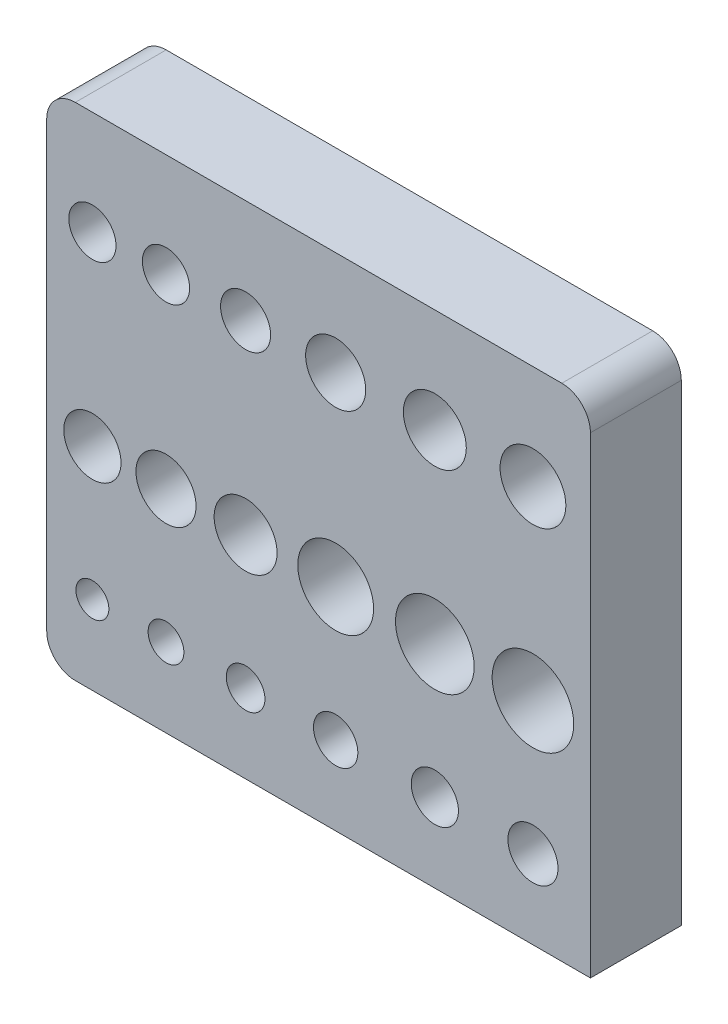
ISO-10303-21;
HEADER;
FILE_DESCRIPTION(('STEP AP214'),'2;1');
FILE_NAME('part.step','',(''),(''),'','','');
FILE_SCHEMA(('AUTOMOTIVE_DESIGN { 1 0 10303 214 1 1 1 1 }'));
ENDSEC;
DATA;
#1=APPLICATION_CONTEXT('core data for automotive mechanical design processes');
#2=APPLICATION_PROTOCOL_DEFINITION('international standard','automotive_design',2000,#1);
#3=PRODUCT_CONTEXT('',#1,'mechanical');
#4=PRODUCT('Part','Part','',(#3));
#5=PRODUCT_RELATED_PRODUCT_CATEGORY('part','',(#4));
#6=PRODUCT_DEFINITION_FORMATION('','',#4);
#7=PRODUCT_DEFINITION_CONTEXT('part definition',#1,'design');
#8=PRODUCT_DEFINITION('design','',#6,#7);
#9=PRODUCT_DEFINITION_SHAPE('','',#8);
#10=(LENGTH_UNIT() NAMED_UNIT(*) SI_UNIT(.MILLI.,.METRE.));
#11=(NAMED_UNIT(*) PLANE_ANGLE_UNIT() SI_UNIT($,.RADIAN.));
#12=(NAMED_UNIT(*) SI_UNIT($,.STERADIAN.) SOLID_ANGLE_UNIT());
#13=UNCERTAINTY_MEASURE_WITH_UNIT(LENGTH_MEASURE(1.E-05),#10,'distance_accuracy_value','');
#14=(GEOMETRIC_REPRESENTATION_CONTEXT(3) GLOBAL_UNCERTAINTY_ASSIGNED_CONTEXT((#13)) GLOBAL_UNIT_ASSIGNED_CONTEXT((#10,
#11,#12)) REPRESENTATION_CONTEXT('',''));
#15=CARTESIAN_POINT('',(0.,0.,0.));
#16=DIRECTION('',(0.,0.,1.));
#17=DIRECTION('',(1.,0.,0.));
#18=AXIS2_PLACEMENT_3D('',#15,#16,#17);
#19=CARTESIAN_POINT('',(36.,33.,6.35));
#20=DIRECTION('',(0.,0.,1.));
#21=DIRECTION('',(1.,0.,0.));
#22=AXIS2_PLACEMENT_3D('',#19,#20,#21);
#23=PLANE('',#22);
#24=CARTESIAN_POINT('',(20.1951258110461,5.5043071483383,6.35));
#25=DIRECTION('',(0.,0.,1.));
#26=DIRECTION('',(1.,0.,0.));
#27=AXIS2_PLACEMENT_3D('',#24,#25,#26);
#28=CIRCLE('',#27,1.55);
#29=CARTESIAN_POINT('',(21.7451258110461,5.5043071483383,6.35));
#30=VERTEX_POINT('',#29);
#31=EDGE_CURVE('E312',#30,#30,#28,.T.);
#32=ORIENTED_EDGE('',*,*,#31,.F.);
#33=EDGE_LOOP('',(#32));
#34=FACE_BOUND('',#33,.T.);
#35=CARTESIAN_POINT('',(13.8995540887951,5.5043071483383,6.35));
#36=DIRECTION('',(0.,0.,1.));
#37=DIRECTION('',(1.,0.,0.));
#38=AXIS2_PLACEMENT_3D('',#35,#36,#37);
#39=CIRCLE('',#38,1.35);
#40=CARTESIAN_POINT('',(15.2495540887951,5.5043071483383,6.35));
#41=VERTEX_POINT('',#40);
#42=EDGE_CURVE('E296',#41,#41,#39,.T.);
#43=ORIENTED_EDGE('',*,*,#42,.F.);
#44=EDGE_LOOP('',(#43));
#45=FACE_BOUND('',#44,.T.);
#46=CARTESIAN_POINT('',(8.33636071918448,5.5043071483383,6.35));
#47=DIRECTION('',(0.,0.,1.));
#48=DIRECTION('',(1.,0.,0.));
#49=AXIS2_PLACEMENT_3D('',#46,#47,#48);
#50=CIRCLE('',#49,1.25);
#51=CARTESIAN_POINT('',(9.58636071918448,5.5043071483383,6.35));
#52=VERTEX_POINT('',#51);
#53=EDGE_CURVE('E280',#52,#52,#50,.T.);
#54=ORIENTED_EDGE('',*,*,#53,.F.);
#55=EDGE_LOOP('',(#54));
#56=FACE_BOUND('',#55,.T.);
#57=CARTESIAN_POINT('',(3.19279995644933,14.7750347277171,6.35));
#58=DIRECTION('',(0.,0.,1.));
#59=DIRECTION('',(1.,0.,0.));
#60=AXIS2_PLACEMENT_3D('',#57,#58,#59);
#61=CIRCLE('',#60,2.);
#62=CARTESIAN_POINT('',(5.19279995644933,14.7750347277171,6.35));
#63=VERTEX_POINT('',#62);
#64=EDGE_CURVE('E264',#63,#63,#61,.T.);
#65=ORIENTED_EDGE('',*,*,#64,.F.);
#66=EDGE_LOOP('',(#65));
#67=FACE_BOUND('',#66,.T.);
#68=CARTESIAN_POINT('',(33.9827261889333,14.7750347277171,6.35));
#69=DIRECTION('',(0.,0.,1.));
#70=DIRECTION('',(1.,0.,0.));
#71=AXIS2_PLACEMENT_3D('',#68,#69,#70);
#72=CIRCLE('',#71,2.85);
#73=CARTESIAN_POINT('',(36.8327261889333,14.7750347277171,6.35));
#74=VERTEX_POINT('',#73);
#75=EDGE_CURVE('E248',#74,#74,#72,.T.);
#76=ORIENTED_EDGE('',*,*,#75,.F.);
#77=EDGE_LOOP('',(#76));
#78=FACE_BOUND('',#77,.T.);
#79=CARTESIAN_POINT('',(20.1951258110461,27.7374283855189,6.35));
#80=DIRECTION('',(0.,0.,1.));
#81=DIRECTION('',(1.,0.,0.));
#82=AXIS2_PLACEMENT_3D('',#79,#80,#81);
#83=CIRCLE('',#82,2.1);
#84=CARTESIAN_POINT('',(22.2951258110461,27.7374283855189,6.35));
#85=VERTEX_POINT('',#84);
#86=EDGE_CURVE('E232',#85,#85,#83,.T.);
#87=ORIENTED_EDGE('',*,*,#86,.F.);
#88=EDGE_LOOP('',(#87));
#89=FACE_BOUND('',#88,.T.);
#90=CARTESIAN_POINT('',(13.8995540887951,27.7374283855189,6.35));
#91=DIRECTION('',(0.,0.,1.));
#92=DIRECTION('',(1.,0.,0.));
#93=AXIS2_PLACEMENT_3D('',#90,#91,#92);
#94=CIRCLE('',#93,1.75);
#95=CARTESIAN_POINT('',(15.6495540887951,27.7374283855189,6.35));
#96=VERTEX_POINT('',#95);
#97=EDGE_CURVE('E216',#96,#96,#94,.T.);
#98=ORIENTED_EDGE('',*,*,#97,.F.);
#99=EDGE_LOOP('',(#98));
#100=FACE_BOUND('',#99,.T.);
#101=CARTESIAN_POINT('',(8.33636071918448,14.7750347277171,6.35));
#102=DIRECTION('',(0.,0.,1.));
#103=DIRECTION('',(1.,0.,0.));
#104=AXIS2_PLACEMENT_3D('',#101,#102,#103);
#105=CIRCLE('',#104,2.1);
#106=CARTESIAN_POINT('',(10.4363607191845,14.7750347277171,6.35));
#107=VERTEX_POINT('',#106);
#108=EDGE_CURVE('E200',#107,#107,#105,.T.);
#109=ORIENTED_EDGE('',*,*,#108,.F.);
#110=EDGE_LOOP('',(#109));
#111=FACE_BOUND('',#110,.T.);
#112=CARTESIAN_POINT('',(8.33636071918448,27.7374283855189,6.35));
#113=DIRECTION('',(0.,0.,1.));
#114=DIRECTION('',(1.,0.,0.));
#115=AXIS2_PLACEMENT_3D('',#112,#113,#114);
#116=CIRCLE('',#115,1.65);
#117=CARTESIAN_POINT('',(9.98636071918448,27.7374283855189,6.35));
#118=VERTEX_POINT('',#117);
#119=EDGE_CURVE('E140',#118,#118,#116,.T.);
#120=ORIENTED_EDGE('',*,*,#119,.F.);
#121=EDGE_LOOP('',(#120));
#122=FACE_BOUND('',#121,.T.);
#123=DIRECTION('',(0.,1.,0.));
#124=VECTOR('',#123,1.);
#125=CARTESIAN_POINT('',(38.,0.,6.35));
#126=LINE('',#125,#124);
#127=CARTESIAN_POINT('',(38.,0.,6.35));
#128=VERTEX_POINT('',#127);
#129=CARTESIAN_POINT('',(38.,33.,6.35));
#130=VERTEX_POINT('',#129);
#131=EDGE_CURVE('E155',#128,#130,#126,.T.);
#132=ORIENTED_EDGE('',*,*,#131,.T.);
#133=CARTESIAN_POINT('',(36.,33.,6.35));
#134=DIRECTION('',(0.,0.,1.));
#135=DIRECTION('',(1.,0.,0.));
#136=AXIS2_PLACEMENT_3D('',#133,#134,#135);
#137=CIRCLE('',#136,2.);
#138=CARTESIAN_POINT('',(36.,35.,6.35));
#139=VERTEX_POINT('',#138);
#140=EDGE_CURVE('E97',#130,#139,#137,.T.);
#141=ORIENTED_EDGE('',*,*,#140,.T.);
#142=DIRECTION('',(-1.,0.,0.));
#143=VECTOR('',#142,1.);
#144=CARTESIAN_POINT('',(2.00000000000001,35.,6.35));
#145=LINE('',#144,#143);
#146=CARTESIAN_POINT('',(2.00000000000001,35.,6.35));
#147=VERTEX_POINT('',#146);
#148=EDGE_CURVE('E172',#139,#147,#145,.T.);
#149=ORIENTED_EDGE('',*,*,#148,.T.);
#150=CARTESIAN_POINT('',(2.,33.,6.35));
#151=DIRECTION('',(0.,0.,1.));
#152=DIRECTION('',(-1.,0.,0.));
#153=AXIS2_PLACEMENT_3D('',#150,#151,#152);
#154=CIRCLE('',#153,2.);
#155=CARTESIAN_POINT('',(0.,33.,6.35));
#156=VERTEX_POINT('',#155);
#157=EDGE_CURVE('E113',#147,#156,#154,.T.);
#158=ORIENTED_EDGE('',*,*,#157,.T.);
#159=DIRECTION('',(0.,-1.,0.));
#160=VECTOR('',#159,1.);
#161=CARTESIAN_POINT('',(0.,2.00000000000001,6.35));
#162=LINE('',#161,#160);
#163=CARTESIAN_POINT('',(0.,2.00000000000001,6.35));
#164=VERTEX_POINT('',#163);
#165=EDGE_CURVE('E107',#156,#164,#162,.T.);
#166=ORIENTED_EDGE('',*,*,#165,.T.);
#167=CARTESIAN_POINT('',(2.,2.,6.35));
#168=DIRECTION('',(0.,0.,1.));
#169=DIRECTION('',(1.,0.,0.));
#170=AXIS2_PLACEMENT_3D('',#167,#168,#169);
#171=CIRCLE('',#170,2.);
#172=CARTESIAN_POINT('',(2.00000000000001,0.,6.35));
#173=VERTEX_POINT('',#172);
#174=EDGE_CURVE('E111',#164,#173,#171,.T.);
#175=ORIENTED_EDGE('',*,*,#174,.T.);
#176=DIRECTION('',(1.,0.,0.));
#177=VECTOR('',#176,1.);
#178=CARTESIAN_POINT('',(2.00000000000001,0.,6.35));
#179=LINE('',#178,#177);
#180=EDGE_CURVE('E57',#173,#128,#179,.T.);
#181=ORIENTED_EDGE('',*,*,#180,.T.);
#182=EDGE_LOOP('',(#132,#141,#149,#158,#166,#175,#181));
#183=FACE_BOUND('',#182,.T.);
#184=CARTESIAN_POINT('',(27.1246451719531,27.7374283855189,6.35));
#185=DIRECTION('',(0.,0.,1.));
#186=DIRECTION('',(1.,0.,0.));
#187=AXIS2_PLACEMENT_3D('',#184,#185,#186);
#188=CIRCLE('',#187,2.2);
#189=CARTESIAN_POINT('',(29.3246451719531,27.7374283855189,6.35));
#190=VERTEX_POINT('',#189);
#191=EDGE_CURVE('E192',#190,#190,#188,.T.);
#192=ORIENTED_EDGE('',*,*,#191,.F.);
#193=EDGE_LOOP('',(#192));
#194=FACE_BOUND('',#193,.T.);
#195=CARTESIAN_POINT('',(27.1246451719531,14.7750347277171,6.35));
#196=DIRECTION('',(0.,0.,1.));
#197=DIRECTION('',(1.,0.,0.));
#198=AXIS2_PLACEMENT_3D('',#195,#196,#197);
#199=CIRCLE('',#198,2.75);
#200=CARTESIAN_POINT('',(29.8746451719531,14.7750347277171,6.35));
#201=VERTEX_POINT('',#200);
#202=EDGE_CURVE('E208',#201,#201,#199,.T.);
#203=ORIENTED_EDGE('',*,*,#202,.F.);
#204=EDGE_LOOP('',(#203));
#205=FACE_BOUND('',#204,.T.);
#206=CARTESIAN_POINT('',(33.9827261889333,27.7374283855189,6.35));
#207=DIRECTION('',(0.,0.,1.));
#208=DIRECTION('',(1.,0.,0.));
#209=AXIS2_PLACEMENT_3D('',#206,#207,#208);
#210=CIRCLE('',#209,2.30000000000001);
#211=CARTESIAN_POINT('',(36.2827261889333,27.7374283855189,6.35));
#212=VERTEX_POINT('',#211);
#213=EDGE_CURVE('E224',#212,#212,#210,.T.);
#214=ORIENTED_EDGE('',*,*,#213,.F.);
#215=EDGE_LOOP('',(#214));
#216=FACE_BOUND('',#215,.T.);
#217=CARTESIAN_POINT('',(3.19279995644933,27.7374283855189,6.35));
#218=DIRECTION('',(0.,0.,1.));
#219=DIRECTION('',(1.,0.,0.));
#220=AXIS2_PLACEMENT_3D('',#217,#218,#219);
#221=CIRCLE('',#220,1.65);
#222=CARTESIAN_POINT('',(4.84279995644933,27.7374283855189,6.35));
#223=VERTEX_POINT('',#222);
#224=EDGE_CURVE('E240',#223,#223,#221,.T.);
#225=ORIENTED_EDGE('',*,*,#224,.F.);
#226=EDGE_LOOP('',(#225));
#227=FACE_BOUND('',#226,.T.);
#228=CARTESIAN_POINT('',(20.1951258110461,14.7750347277171,6.35));
#229=DIRECTION('',(0.,0.,1.));
#230=DIRECTION('',(1.,0.,0.));
#231=AXIS2_PLACEMENT_3D('',#228,#229,#230);
#232=CIRCLE('',#231,2.65);
#233=CARTESIAN_POINT('',(22.8451258110461,14.7750347277171,6.35));
#234=VERTEX_POINT('',#233);
#235=EDGE_CURVE('E256',#234,#234,#232,.T.);
#236=ORIENTED_EDGE('',*,*,#235,.F.);
#237=EDGE_LOOP('',(#236));
#238=FACE_BOUND('',#237,.T.);
#239=CARTESIAN_POINT('',(13.8995540887951,14.7750347277171,6.35));
#240=DIRECTION('',(0.,0.,1.));
#241=DIRECTION('',(1.,0.,0.));
#242=AXIS2_PLACEMENT_3D('',#239,#240,#241);
#243=CIRCLE('',#242,2.2);
#244=CARTESIAN_POINT('',(16.0995540887951,14.7750347277171,6.35));
#245=VERTEX_POINT('',#244);
#246=EDGE_CURVE('E272',#245,#245,#243,.T.);
#247=ORIENTED_EDGE('',*,*,#246,.F.);
#248=EDGE_LOOP('',(#247));
#249=FACE_BOUND('',#248,.T.);
#250=CARTESIAN_POINT('',(27.1246451719531,5.5043071483383,6.35));
#251=DIRECTION('',(0.,0.,1.));
#252=DIRECTION('',(1.,0.,0.));
#253=AXIS2_PLACEMENT_3D('',#250,#251,#252);
#254=CIRCLE('',#253,1.65);
#255=CARTESIAN_POINT('',(28.7746451719531,5.5043071483383,6.35));
#256=VERTEX_POINT('',#255);
#257=EDGE_CURVE('E288',#256,#256,#254,.T.);
#258=ORIENTED_EDGE('',*,*,#257,.F.);
#259=EDGE_LOOP('',(#258));
#260=FACE_BOUND('',#259,.T.);
#261=CARTESIAN_POINT('',(33.9827261889333,5.5043071483383,6.35));
#262=DIRECTION('',(0.,0.,1.));
#263=DIRECTION('',(1.,0.,0.));
#264=AXIS2_PLACEMENT_3D('',#261,#262,#263);
#265=CIRCLE('',#264,1.75);
#266=CARTESIAN_POINT('',(35.7327261889333,5.5043071483383,6.35));
#267=VERTEX_POINT('',#266);
#268=EDGE_CURVE('E304',#267,#267,#265,.T.);
#269=ORIENTED_EDGE('',*,*,#268,.F.);
#270=EDGE_LOOP('',(#269));
#271=FACE_BOUND('',#270,.T.);
#272=CARTESIAN_POINT('',(3.19279995644933,5.5043071483383,6.35));
#273=DIRECTION('',(0.,0.,1.));
#274=DIRECTION('',(1.,0.,0.));
#275=AXIS2_PLACEMENT_3D('',#272,#273,#274);
#276=CIRCLE('',#275,1.15);
#277=CARTESIAN_POINT('',(4.34279995644933,5.5043071483383,6.35));
#278=VERTEX_POINT('',#277);
#279=EDGE_CURVE('E320',#278,#278,#276,.T.);
#280=ORIENTED_EDGE('',*,*,#279,.F.);
#281=EDGE_LOOP('',(#280));
#282=FACE_BOUND('',#281,.T.);
#283=ADVANCED_FACE('F39',(#34,#45,#56,#67,#78,#89,#100,#111,#122,#183,#194,#205,#216,#227,#238,
#249,#260,#271,#282),#23,.T.);
#284=CARTESIAN_POINT('',(36.,33.,0.));
#285=DIRECTION('',(0.,0.,1.));
#286=DIRECTION('',(1.,0.,0.));
#287=AXIS2_PLACEMENT_3D('',#284,#285,#286);
#288=PLANE('',#287);
#289=DIRECTION('',(0.,1.,0.));
#290=VECTOR('',#289,1.);
#291=CARTESIAN_POINT('',(38.,0.,0.));
#292=LINE('',#291,#290);
#293=CARTESIAN_POINT('',(38.,0.,0.));
#294=VERTEX_POINT('',#293);
#295=CARTESIAN_POINT('',(38.,33.,0.));
#296=VERTEX_POINT('',#295);
#297=EDGE_CURVE('E135',#294,#296,#292,.T.);
#298=ORIENTED_EDGE('',*,*,#297,.F.);
#299=DIRECTION('',(1.,0.,0.));
#300=VECTOR('',#299,1.);
#301=CARTESIAN_POINT('',(2.00000000000001,0.,0.));
#302=LINE('',#301,#300);
#303=CARTESIAN_POINT('',(2.00000000000001,0.,0.));
#304=VERTEX_POINT('',#303);
#305=EDGE_CURVE('E89',#304,#294,#302,.T.);
#306=ORIENTED_EDGE('',*,*,#305,.F.);
#307=CARTESIAN_POINT('',(2.,2.,0.));
#308=DIRECTION('',(0.,0.,1.));
#309=DIRECTION('',(1.,0.,0.));
#310=AXIS2_PLACEMENT_3D('',#307,#308,#309);
#311=CIRCLE('',#310,2.);
#312=CARTESIAN_POINT('',(0.,2.00000000000001,0.));
#313=VERTEX_POINT('',#312);
#314=EDGE_CURVE('E83',#313,#304,#311,.T.);
#315=ORIENTED_EDGE('',*,*,#314,.F.);
#316=DIRECTION('',(0.,-1.,0.));
#317=VECTOR('',#316,1.);
#318=CARTESIAN_POINT('',(0.,2.00000000000001,0.));
#319=LINE('',#318,#317);
#320=CARTESIAN_POINT('',(0.,33.,0.));
#321=VERTEX_POINT('',#320);
#322=EDGE_CURVE('E122',#321,#313,#319,.T.);
#323=ORIENTED_EDGE('',*,*,#322,.F.);
#324=CARTESIAN_POINT('',(2.,33.,0.));
#325=DIRECTION('',(0.,0.,1.));
#326=DIRECTION('',(-1.,0.,0.));
#327=AXIS2_PLACEMENT_3D('',#324,#325,#326);
#328=CIRCLE('',#327,2.);
#329=CARTESIAN_POINT('',(2.00000000000001,35.,0.));
#330=VERTEX_POINT('',#329);
#331=EDGE_CURVE('E146',#330,#321,#328,.T.);
#332=ORIENTED_EDGE('',*,*,#331,.F.);
#333=DIRECTION('',(-1.,0.,0.));
#334=VECTOR('',#333,1.);
#335=CARTESIAN_POINT('',(2.00000000000001,35.,0.));
#336=LINE('',#335,#334);
#337=CARTESIAN_POINT('',(36.,35.,0.));
#338=VERTEX_POINT('',#337);
#339=EDGE_CURVE('E143',#338,#330,#336,.T.);
#340=ORIENTED_EDGE('',*,*,#339,.F.);
#341=CARTESIAN_POINT('',(36.,33.,0.));
#342=DIRECTION('',(0.,0.,1.));
#343=DIRECTION('',(1.,0.,0.));
#344=AXIS2_PLACEMENT_3D('',#341,#342,#343);
#345=CIRCLE('',#344,2.);
#346=EDGE_CURVE('E139',#296,#338,#345,.T.);
#347=ORIENTED_EDGE('',*,*,#346,.F.);
#348=EDGE_LOOP('',(#298,#306,#315,#323,#332,#340,#347));
#349=FACE_BOUND('',#348,.T.);
#350=CARTESIAN_POINT('',(8.33636071918448,27.7374283855189,0.));
#351=DIRECTION('',(0.,0.,1.));
#352=DIRECTION('',(1.,0.,0.));
#353=AXIS2_PLACEMENT_3D('',#350,#351,#352);
#354=CIRCLE('',#353,1.65);
#355=CARTESIAN_POINT('',(9.98636071918448,27.7374283855189,0.));
#356=VERTEX_POINT('',#355);
#357=EDGE_CURVE('E188',#356,#356,#354,.T.);
#358=ORIENTED_EDGE('',*,*,#357,.T.);
#359=EDGE_LOOP('',(#358));
#360=FACE_BOUND('',#359,.T.);
#361=CARTESIAN_POINT('',(27.1246451719531,27.7374283855189,0.));
#362=DIRECTION('',(0.,0.,1.));
#363=DIRECTION('',(1.,0.,0.));
#364=AXIS2_PLACEMENT_3D('',#361,#362,#363);
#365=CIRCLE('',#364,2.2);
#366=CARTESIAN_POINT('',(29.3246451719531,27.7374283855189,0.));
#367=VERTEX_POINT('',#366);
#368=EDGE_CURVE('E196',#367,#367,#365,.T.);
#369=ORIENTED_EDGE('',*,*,#368,.T.);
#370=EDGE_LOOP('',(#369));
#371=FACE_BOUND('',#370,.T.);
#372=CARTESIAN_POINT('',(8.33636071918448,14.7750347277171,0.));
#373=DIRECTION('',(0.,0.,1.));
#374=DIRECTION('',(1.,0.,0.));
#375=AXIS2_PLACEMENT_3D('',#372,#373,#374);
#376=CIRCLE('',#375,2.1);
#377=CARTESIAN_POINT('',(10.4363607191845,14.7750347277171,0.));
#378=VERTEX_POINT('',#377);
#379=EDGE_CURVE('E204',#378,#378,#376,.T.);
#380=ORIENTED_EDGE('',*,*,#379,.T.);
#381=EDGE_LOOP('',(#380));
#382=FACE_BOUND('',#381,.T.);
#383=CARTESIAN_POINT('',(27.1246451719531,14.7750347277171,0.));
#384=DIRECTION('',(0.,0.,1.));
#385=DIRECTION('',(1.,0.,0.));
#386=AXIS2_PLACEMENT_3D('',#383,#384,#385);
#387=CIRCLE('',#386,2.75);
#388=CARTESIAN_POINT('',(29.8746451719531,14.7750347277171,0.));
#389=VERTEX_POINT('',#388);
#390=EDGE_CURVE('E212',#389,#389,#387,.T.);
#391=ORIENTED_EDGE('',*,*,#390,.T.);
#392=EDGE_LOOP('',(#391));
#393=FACE_BOUND('',#392,.T.);
#394=CARTESIAN_POINT('',(13.8995540887951,27.7374283855189,0.));
#395=DIRECTION('',(0.,0.,1.));
#396=DIRECTION('',(1.,0.,0.));
#397=AXIS2_PLACEMENT_3D('',#394,#395,#396);
#398=CIRCLE('',#397,1.75);
#399=CARTESIAN_POINT('',(15.6495540887951,27.7374283855189,0.));
#400=VERTEX_POINT('',#399);
#401=EDGE_CURVE('E220',#400,#400,#398,.T.);
#402=ORIENTED_EDGE('',*,*,#401,.T.);
#403=EDGE_LOOP('',(#402));
#404=FACE_BOUND('',#403,.T.);
#405=CARTESIAN_POINT('',(33.9827261889333,27.7374283855189,0.));
#406=DIRECTION('',(0.,0.,1.));
#407=DIRECTION('',(1.,0.,0.));
#408=AXIS2_PLACEMENT_3D('',#405,#406,#407);
#409=CIRCLE('',#408,2.30000000000001);
#410=CARTESIAN_POINT('',(36.2827261889333,27.7374283855189,0.));
#411=VERTEX_POINT('',#410);
#412=EDGE_CURVE('E228',#411,#411,#409,.T.);
#413=ORIENTED_EDGE('',*,*,#412,.T.);
#414=EDGE_LOOP('',(#413));
#415=FACE_BOUND('',#414,.T.);
#416=CARTESIAN_POINT('',(20.1951258110461,27.7374283855189,0.));
#417=DIRECTION('',(0.,0.,1.));
#418=DIRECTION('',(1.,0.,0.));
#419=AXIS2_PLACEMENT_3D('',#416,#417,#418);
#420=CIRCLE('',#419,2.1);
#421=CARTESIAN_POINT('',(22.2951258110461,27.7374283855189,0.));
#422=VERTEX_POINT('',#421);
#423=EDGE_CURVE('E236',#422,#422,#420,.T.);
#424=ORIENTED_EDGE('',*,*,#423,.T.);
#425=EDGE_LOOP('',(#424));
#426=FACE_BOUND('',#425,.T.);
#427=CARTESIAN_POINT('',(3.19279995644933,27.7374283855189,0.));
#428=DIRECTION('',(0.,0.,1.));
#429=DIRECTION('',(1.,0.,0.));
#430=AXIS2_PLACEMENT_3D('',#427,#428,#429);
#431=CIRCLE('',#430,1.65);
#432=CARTESIAN_POINT('',(4.84279995644933,27.7374283855189,0.));
#433=VERTEX_POINT('',#432);
#434=EDGE_CURVE('E244',#433,#433,#431,.T.);
#435=ORIENTED_EDGE('',*,*,#434,.T.);
#436=EDGE_LOOP('',(#435));
#437=FACE_BOUND('',#436,.T.);
#438=CARTESIAN_POINT('',(33.9827261889333,14.7750347277171,0.));
#439=DIRECTION('',(0.,0.,1.));
#440=DIRECTION('',(1.,0.,0.));
#441=AXIS2_PLACEMENT_3D('',#438,#439,#440);
#442=CIRCLE('',#441,2.85);
#443=CARTESIAN_POINT('',(36.8327261889333,14.7750347277171,0.));
#444=VERTEX_POINT('',#443);
#445=EDGE_CURVE('E252',#444,#444,#442,.T.);
#446=ORIENTED_EDGE('',*,*,#445,.T.);
#447=EDGE_LOOP('',(#446));
#448=FACE_BOUND('',#447,.T.);
#449=CARTESIAN_POINT('',(20.1951258110461,14.7750347277171,0.));
#450=DIRECTION('',(0.,0.,1.));
#451=DIRECTION('',(1.,0.,0.));
#452=AXIS2_PLACEMENT_3D('',#449,#450,#451);
#453=CIRCLE('',#452,2.65);
#454=CARTESIAN_POINT('',(22.8451258110461,14.7750347277171,0.));
#455=VERTEX_POINT('',#454);
#456=EDGE_CURVE('E260',#455,#455,#453,.T.);
#457=ORIENTED_EDGE('',*,*,#456,.T.);
#458=EDGE_LOOP('',(#457));
#459=FACE_BOUND('',#458,.T.);
#460=CARTESIAN_POINT('',(3.19279995644933,14.7750347277171,0.));
#461=DIRECTION('',(0.,0.,1.));
#462=DIRECTION('',(1.,0.,0.));
#463=AXIS2_PLACEMENT_3D('',#460,#461,#462);
#464=CIRCLE('',#463,2.);
#465=CARTESIAN_POINT('',(5.19279995644933,14.7750347277171,0.));
#466=VERTEX_POINT('',#465);
#467=EDGE_CURVE('E268',#466,#466,#464,.T.);
#468=ORIENTED_EDGE('',*,*,#467,.T.);
#469=EDGE_LOOP('',(#468));
#470=FACE_BOUND('',#469,.T.);
#471=CARTESIAN_POINT('',(13.8995540887951,14.7750347277171,0.));
#472=DIRECTION('',(0.,0.,1.));
#473=DIRECTION('',(1.,0.,0.));
#474=AXIS2_PLACEMENT_3D('',#471,#472,#473);
#475=CIRCLE('',#474,2.2);
#476=CARTESIAN_POINT('',(16.0995540887951,14.7750347277171,0.));
#477=VERTEX_POINT('',#476);
#478=EDGE_CURVE('E276',#477,#477,#475,.T.);
#479=ORIENTED_EDGE('',*,*,#478,.T.);
#480=EDGE_LOOP('',(#479));
#481=FACE_BOUND('',#480,.T.);
#482=CARTESIAN_POINT('',(8.33636071918448,5.5043071483383,0.));
#483=DIRECTION('',(0.,0.,1.));
#484=DIRECTION('',(1.,0.,0.));
#485=AXIS2_PLACEMENT_3D('',#482,#483,#484);
#486=CIRCLE('',#485,1.25);
#487=CARTESIAN_POINT('',(9.58636071918448,5.5043071483383,0.));
#488=VERTEX_POINT('',#487);
#489=EDGE_CURVE('E284',#488,#488,#486,.T.);
#490=ORIENTED_EDGE('',*,*,#489,.T.);
#491=EDGE_LOOP('',(#490));
#492=FACE_BOUND('',#491,.T.);
#493=CARTESIAN_POINT('',(27.1246451719531,5.5043071483383,0.));
#494=DIRECTION('',(0.,0.,1.));
#495=DIRECTION('',(1.,0.,0.));
#496=AXIS2_PLACEMENT_3D('',#493,#494,#495);
#497=CIRCLE('',#496,1.65);
#498=CARTESIAN_POINT('',(28.7746451719531,5.5043071483383,0.));
#499=VERTEX_POINT('',#498);
#500=EDGE_CURVE('E292',#499,#499,#497,.T.);
#501=ORIENTED_EDGE('',*,*,#500,.T.);
#502=EDGE_LOOP('',(#501));
#503=FACE_BOUND('',#502,.T.);
#504=CARTESIAN_POINT('',(13.8995540887951,5.5043071483383,0.));
#505=DIRECTION('',(0.,0.,1.));
#506=DIRECTION('',(1.,0.,0.));
#507=AXIS2_PLACEMENT_3D('',#504,#505,#506);
#508=CIRCLE('',#507,1.35);
#509=CARTESIAN_POINT('',(15.2495540887951,5.5043071483383,0.));
#510=VERTEX_POINT('',#509);
#511=EDGE_CURVE('E300',#510,#510,#508,.T.);
#512=ORIENTED_EDGE('',*,*,#511,.T.);
#513=EDGE_LOOP('',(#512));
#514=FACE_BOUND('',#513,.T.);
#515=CARTESIAN_POINT('',(33.9827261889333,5.5043071483383,0.));
#516=DIRECTION('',(0.,0.,1.));
#517=DIRECTION('',(1.,0.,0.));
#518=AXIS2_PLACEMENT_3D('',#515,#516,#517);
#519=CIRCLE('',#518,1.75);
#520=CARTESIAN_POINT('',(35.7327261889333,5.5043071483383,0.));
#521=VERTEX_POINT('',#520);
#522=EDGE_CURVE('E308',#521,#521,#519,.T.);
#523=ORIENTED_EDGE('',*,*,#522,.T.);
#524=EDGE_LOOP('',(#523));
#525=FACE_BOUND('',#524,.T.);
#526=CARTESIAN_POINT('',(20.1951258110461,5.5043071483383,0.));
#527=DIRECTION('',(0.,0.,1.));
#528=DIRECTION('',(1.,0.,0.));
#529=AXIS2_PLACEMENT_3D('',#526,#527,#528);
#530=CIRCLE('',#529,1.55);
#531=CARTESIAN_POINT('',(21.7451258110461,5.5043071483383,0.));
#532=VERTEX_POINT('',#531);
#533=EDGE_CURVE('E316',#532,#532,#530,.T.);
#534=ORIENTED_EDGE('',*,*,#533,.T.);
#535=EDGE_LOOP('',(#534));
#536=FACE_BOUND('',#535,.T.);
#537=CARTESIAN_POINT('',(3.19279995644933,5.5043071483383,0.));
#538=DIRECTION('',(0.,0.,1.));
#539=DIRECTION('',(1.,0.,0.));
#540=AXIS2_PLACEMENT_3D('',#537,#538,#539);
#541=CIRCLE('',#540,1.15);
#542=CARTESIAN_POINT('',(4.34279995644933,5.5043071483383,0.));
#543=VERTEX_POINT('',#542);
#544=EDGE_CURVE('E324',#543,#543,#541,.T.);
#545=ORIENTED_EDGE('',*,*,#544,.T.);
#546=EDGE_LOOP('',(#545));
#547=FACE_BOUND('',#546,.T.);
#548=ADVANCED_FACE('F176',(#349,#360,#371,#382,#393,#404,#415,#426,#437,#448,#459,#470,#481,
#492,#503,#514,#525,#536,#547),#288,.F.);
#549=CARTESIAN_POINT('',(38.,0.,6.35));
#550=DIRECTION('',(-1.,0.,0.));
#551=DIRECTION('',(0.,0.,1.));
#552=AXIS2_PLACEMENT_3D('',#549,#550,#551);
#553=PLANE('',#552);
#554=ORIENTED_EDGE('',*,*,#297,.T.);
#555=DIRECTION('',(0.,0.,-1.));
#556=VECTOR('',#555,1.);
#557=CARTESIAN_POINT('',(38.,33.,6.35));
#558=LINE('',#557,#556);
#559=EDGE_CURVE('E11',#130,#296,#558,.T.);
#560=ORIENTED_EDGE('',*,*,#559,.F.);
#561=ORIENTED_EDGE('',*,*,#131,.F.);
#562=DIRECTION('',(0.,0.,-1.));
#563=VECTOR('',#562,1.);
#564=CARTESIAN_POINT('',(38.,0.,6.35));
#565=LINE('',#564,#563);
#566=EDGE_CURVE('E131',#128,#294,#565,.T.);
#567=ORIENTED_EDGE('',*,*,#566,.T.);
#568=EDGE_LOOP('',(#554,#560,#561,#567));
#569=FACE_BOUND('',#568,.T.);
#570=ADVANCED_FACE('F41',(#569),#553,.F.);
#571=CARTESIAN_POINT('',(36.,33.,6.35));
#572=DIRECTION('',(0.,0.,-1.));
#573=DIRECTION('',(-1.,0.,0.));
#574=AXIS2_PLACEMENT_3D('',#571,#572,#573);
#575=CYLINDRICAL_SURFACE('',#574,2.);
#576=ORIENTED_EDGE('',*,*,#346,.T.);
#577=DIRECTION('',(0.,0.,-1.));
#578=VECTOR('',#577,1.);
#579=CARTESIAN_POINT('',(36.,35.,6.35));
#580=LINE('',#579,#578);
#581=EDGE_CURVE('E49',#139,#338,#580,.T.);
#582=ORIENTED_EDGE('',*,*,#581,.F.);
#583=ORIENTED_EDGE('',*,*,#140,.F.);
#584=ORIENTED_EDGE('',*,*,#559,.T.);
#585=EDGE_LOOP('',(#576,#582,#583,#584));
#586=FACE_BOUND('',#585,.T.);
#587=ADVANCED_FACE('F358',(#586),#575,.T.);
#588=CARTESIAN_POINT('',(2.00000000000001,35.,6.35));
#589=DIRECTION('',(0.,-1.,0.));
#590=DIRECTION('',(0.,0.,-1.));
#591=AXIS2_PLACEMENT_3D('',#588,#589,#590);
#592=PLANE('',#591);
#593=ORIENTED_EDGE('',*,*,#339,.T.);
#594=DIRECTION('',(0.,0.,-1.));
#595=VECTOR('',#594,1.);
#596=CARTESIAN_POINT('',(2.00000000000001,35.,6.35));
#597=LINE('',#596,#595);
#598=EDGE_CURVE('E162',#147,#330,#597,.T.);
#599=ORIENTED_EDGE('',*,*,#598,.F.);
#600=ORIENTED_EDGE('',*,*,#148,.F.);
#601=ORIENTED_EDGE('',*,*,#581,.T.);
#602=EDGE_LOOP('',(#593,#599,#600,#601));
#603=FACE_BOUND('',#602,.T.);
#604=ADVANCED_FACE('F170',(#603),#592,.F.);
#605=CARTESIAN_POINT('',(2.,33.,6.35));
#606=DIRECTION('',(0.,0.,-1.));
#607=DIRECTION('',(-1.,0.,0.));
#608=AXIS2_PLACEMENT_3D('',#605,#606,#607);
#609=CYLINDRICAL_SURFACE('',#608,2.);
#610=ORIENTED_EDGE('',*,*,#331,.T.);
#611=DIRECTION('',(0.,0.,-1.));
#612=VECTOR('',#611,1.);
#613=CARTESIAN_POINT('',(0.,33.,6.35));
#614=LINE('',#613,#612);
#615=EDGE_CURVE('E124',#156,#321,#614,.T.);
#616=ORIENTED_EDGE('',*,*,#615,.F.);
#617=ORIENTED_EDGE('',*,*,#157,.F.);
#618=ORIENTED_EDGE('',*,*,#598,.T.);
#619=EDGE_LOOP('',(#610,#616,#617,#618));
#620=FACE_BOUND('',#619,.T.);
#621=ADVANCED_FACE('F179',(#620),#609,.T.);
#622=CARTESIAN_POINT('',(0.,2.00000000000001,6.35));
#623=DIRECTION('',(1.,0.,0.));
#624=DIRECTION('',(0.,0.,-1.));
#625=AXIS2_PLACEMENT_3D('',#622,#623,#624);
#626=PLANE('',#625);
#627=ORIENTED_EDGE('',*,*,#322,.T.);
#628=DIRECTION('',(0.,0.,-1.));
#629=VECTOR('',#628,1.);
#630=CARTESIAN_POINT('',(0.,2.00000000000001,6.35));
#631=LINE('',#630,#629);
#632=EDGE_CURVE('E119',#164,#313,#631,.T.);
#633=ORIENTED_EDGE('',*,*,#632,.F.);
#634=ORIENTED_EDGE('',*,*,#165,.F.);
#635=ORIENTED_EDGE('',*,*,#615,.T.);
#636=EDGE_LOOP('',(#627,#633,#634,#635));
#637=FACE_BOUND('',#636,.T.);
#638=ADVANCED_FACE('F120',(#637),#626,.F.);
#639=CARTESIAN_POINT('',(2.,2.,6.35));
#640=DIRECTION('',(0.,0.,-1.));
#641=DIRECTION('',(-1.,0.,0.));
#642=AXIS2_PLACEMENT_3D('',#639,#640,#641);
#643=CYLINDRICAL_SURFACE('',#642,2.);
#644=ORIENTED_EDGE('',*,*,#314,.T.);
#645=DIRECTION('',(0.,0.,-1.));
#646=VECTOR('',#645,1.);
#647=CARTESIAN_POINT('',(2.00000000000001,0.,6.35));
#648=LINE('',#647,#646);
#649=EDGE_CURVE('E125',#173,#304,#648,.T.);
#650=ORIENTED_EDGE('',*,*,#649,.F.);
#651=ORIENTED_EDGE('',*,*,#174,.F.);
#652=ORIENTED_EDGE('',*,*,#632,.T.);
#653=EDGE_LOOP('',(#644,#650,#651,#652));
#654=FACE_BOUND('',#653,.T.);
#655=ADVANCED_FACE('F127',(#654),#643,.T.);
#656=CARTESIAN_POINT('',(2.00000000000001,0.,6.35));
#657=DIRECTION('',(0.,1.,0.));
#658=DIRECTION('',(0.,0.,1.));
#659=AXIS2_PLACEMENT_3D('',#656,#657,#658);
#660=PLANE('',#659);
#661=ORIENTED_EDGE('',*,*,#305,.T.);
#662=ORIENTED_EDGE('',*,*,#566,.F.);
#663=ORIENTED_EDGE('',*,*,#180,.F.);
#664=ORIENTED_EDGE('',*,*,#649,.T.);
#665=EDGE_LOOP('',(#661,#662,#663,#664));
#666=FACE_BOUND('',#665,.T.);
#667=ADVANCED_FACE('F348',(#666),#660,.F.);
#668=CARTESIAN_POINT('',(8.33636071918448,27.7374283855189,6.35));
#669=DIRECTION('',(0.,0.,-1.));
#670=DIRECTION('',(-1.,0.,0.));
#671=AXIS2_PLACEMENT_3D('',#668,#669,#670);
#672=CYLINDRICAL_SURFACE('',#671,1.65);
#673=ORIENTED_EDGE('',*,*,#119,.T.);
#674=EDGE_LOOP('',(#673));
#675=FACE_BOUND('',#674,.T.);
#676=ORIENTED_EDGE('',*,*,#357,.F.);
#677=EDGE_LOOP('',(#676));
#678=FACE_BOUND('',#677,.T.);
#679=ADVANCED_FACE('F345',(#675,#678),#672,.F.);
#680=CARTESIAN_POINT('',(27.1246451719531,27.7374283855189,6.35));
#681=DIRECTION('',(0.,0.,-1.));
#682=DIRECTION('',(-1.,0.,0.));
#683=AXIS2_PLACEMENT_3D('',#680,#681,#682);
#684=CYLINDRICAL_SURFACE('',#683,2.2);
#685=ORIENTED_EDGE('',*,*,#191,.T.);
#686=EDGE_LOOP('',(#685));
#687=FACE_BOUND('',#686,.T.);
#688=ORIENTED_EDGE('',*,*,#368,.F.);
#689=EDGE_LOOP('',(#688));
#690=FACE_BOUND('',#689,.T.);
#691=ADVANCED_FACE('F417',(#687,#690),#684,.F.);
#692=CARTESIAN_POINT('',(8.33636071918448,14.7750347277171,6.35));
#693=DIRECTION('',(0.,0.,-1.));
#694=DIRECTION('',(-1.,0.,0.));
#695=AXIS2_PLACEMENT_3D('',#692,#693,#694);
#696=CYLINDRICAL_SURFACE('',#695,2.1);
#697=ORIENTED_EDGE('',*,*,#108,.T.);
#698=EDGE_LOOP('',(#697));
#699=FACE_BOUND('',#698,.T.);
#700=ORIENTED_EDGE('',*,*,#379,.F.);
#701=EDGE_LOOP('',(#700));
#702=FACE_BOUND('',#701,.T.);
#703=ADVANCED_FACE('F425',(#699,#702),#696,.F.);
#704=CARTESIAN_POINT('',(27.1246451719531,14.7750347277171,6.35));
#705=DIRECTION('',(0.,0.,-1.));
#706=DIRECTION('',(-1.,0.,0.));
#707=AXIS2_PLACEMENT_3D('',#704,#705,#706);
#708=CYLINDRICAL_SURFACE('',#707,2.75);
#709=ORIENTED_EDGE('',*,*,#202,.T.);
#710=EDGE_LOOP('',(#709));
#711=FACE_BOUND('',#710,.T.);
#712=ORIENTED_EDGE('',*,*,#390,.F.);
#713=EDGE_LOOP('',(#712));
#714=FACE_BOUND('',#713,.T.);
#715=ADVANCED_FACE('F433',(#711,#714),#708,.F.);
#716=CARTESIAN_POINT('',(13.8995540887951,27.7374283855189,6.35));
#717=DIRECTION('',(0.,0.,-1.));
#718=DIRECTION('',(-1.,0.,0.));
#719=AXIS2_PLACEMENT_3D('',#716,#717,#718);
#720=CYLINDRICAL_SURFACE('',#719,1.75);
#721=ORIENTED_EDGE('',*,*,#97,.T.);
#722=EDGE_LOOP('',(#721));
#723=FACE_BOUND('',#722,.T.);
#724=ORIENTED_EDGE('',*,*,#401,.F.);
#725=EDGE_LOOP('',(#724));
#726=FACE_BOUND('',#725,.T.);
#727=ADVANCED_FACE('F442',(#723,#726),#720,.F.);
#728=CARTESIAN_POINT('',(33.9827261889333,27.7374283855189,6.35));
#729=DIRECTION('',(0.,0.,-1.));
#730=DIRECTION('',(-1.,0.,0.));
#731=AXIS2_PLACEMENT_3D('',#728,#729,#730);
#732=CYLINDRICAL_SURFACE('',#731,2.30000000000001);
#733=ORIENTED_EDGE('',*,*,#213,.T.);
#734=EDGE_LOOP('',(#733));
#735=FACE_BOUND('',#734,.T.);
#736=ORIENTED_EDGE('',*,*,#412,.F.);
#737=EDGE_LOOP('',(#736));
#738=FACE_BOUND('',#737,.T.);
#739=ADVANCED_FACE('F451',(#735,#738),#732,.F.);
#740=CARTESIAN_POINT('',(20.1951258110461,27.7374283855189,6.35));
#741=DIRECTION('',(0.,0.,-1.));
#742=DIRECTION('',(-1.,0.,0.));
#743=AXIS2_PLACEMENT_3D('',#740,#741,#742);
#744=CYLINDRICAL_SURFACE('',#743,2.1);
#745=ORIENTED_EDGE('',*,*,#86,.T.);
#746=EDGE_LOOP('',(#745));
#747=FACE_BOUND('',#746,.T.);
#748=ORIENTED_EDGE('',*,*,#423,.F.);
#749=EDGE_LOOP('',(#748));
#750=FACE_BOUND('',#749,.T.);
#751=ADVANCED_FACE('F460',(#747,#750),#744,.F.);
#752=CARTESIAN_POINT('',(3.19279995644933,27.7374283855189,6.35));
#753=DIRECTION('',(0.,0.,-1.));
#754=DIRECTION('',(-1.,0.,0.));
#755=AXIS2_PLACEMENT_3D('',#752,#753,#754);
#756=CYLINDRICAL_SURFACE('',#755,1.65);
#757=ORIENTED_EDGE('',*,*,#224,.T.);
#758=EDGE_LOOP('',(#757));
#759=FACE_BOUND('',#758,.T.);
#760=ORIENTED_EDGE('',*,*,#434,.F.);
#761=EDGE_LOOP('',(#760));
#762=FACE_BOUND('',#761,.T.);
#763=ADVANCED_FACE('F469',(#759,#762),#756,.F.);
#764=CARTESIAN_POINT('',(33.9827261889333,14.7750347277171,6.35));
#765=DIRECTION('',(0.,0.,-1.));
#766=DIRECTION('',(-1.,0.,0.));
#767=AXIS2_PLACEMENT_3D('',#764,#765,#766);
#768=CYLINDRICAL_SURFACE('',#767,2.85);
#769=ORIENTED_EDGE('',*,*,#75,.T.);
#770=EDGE_LOOP('',(#769));
#771=FACE_BOUND('',#770,.T.);
#772=ORIENTED_EDGE('',*,*,#445,.F.);
#773=EDGE_LOOP('',(#772));
#774=FACE_BOUND('',#773,.T.);
#775=ADVANCED_FACE('F478',(#771,#774),#768,.F.);
#776=CARTESIAN_POINT('',(20.1951258110461,14.7750347277171,6.35));
#777=DIRECTION('',(0.,0.,-1.));
#778=DIRECTION('',(-1.,0.,0.));
#779=AXIS2_PLACEMENT_3D('',#776,#777,#778);
#780=CYLINDRICAL_SURFACE('',#779,2.65);
#781=ORIENTED_EDGE('',*,*,#235,.T.);
#782=EDGE_LOOP('',(#781));
#783=FACE_BOUND('',#782,.T.);
#784=ORIENTED_EDGE('',*,*,#456,.F.);
#785=EDGE_LOOP('',(#784));
#786=FACE_BOUND('',#785,.T.);
#787=ADVANCED_FACE('F487',(#783,#786),#780,.F.);
#788=CARTESIAN_POINT('',(3.19279995644933,14.7750347277171,6.35));
#789=DIRECTION('',(0.,0.,-1.));
#790=DIRECTION('',(-1.,0.,0.));
#791=AXIS2_PLACEMENT_3D('',#788,#789,#790);
#792=CYLINDRICAL_SURFACE('',#791,2.);
#793=ORIENTED_EDGE('',*,*,#64,.T.);
#794=EDGE_LOOP('',(#793));
#795=FACE_BOUND('',#794,.T.);
#796=ORIENTED_EDGE('',*,*,#467,.F.);
#797=EDGE_LOOP('',(#796));
#798=FACE_BOUND('',#797,.T.);
#799=ADVANCED_FACE('F496',(#795,#798),#792,.F.);
#800=CARTESIAN_POINT('',(13.8995540887951,14.7750347277171,6.35));
#801=DIRECTION('',(0.,0.,-1.));
#802=DIRECTION('',(-1.,0.,0.));
#803=AXIS2_PLACEMENT_3D('',#800,#801,#802);
#804=CYLINDRICAL_SURFACE('',#803,2.2);
#805=ORIENTED_EDGE('',*,*,#246,.T.);
#806=EDGE_LOOP('',(#805));
#807=FACE_BOUND('',#806,.T.);
#808=ORIENTED_EDGE('',*,*,#478,.F.);
#809=EDGE_LOOP('',(#808));
#810=FACE_BOUND('',#809,.T.);
#811=ADVANCED_FACE('F505',(#807,#810),#804,.F.);
#812=CARTESIAN_POINT('',(8.33636071918448,5.5043071483383,6.35));
#813=DIRECTION('',(0.,0.,-1.));
#814=DIRECTION('',(-1.,0.,0.));
#815=AXIS2_PLACEMENT_3D('',#812,#813,#814);
#816=CYLINDRICAL_SURFACE('',#815,1.25);
#817=ORIENTED_EDGE('',*,*,#53,.T.);
#818=EDGE_LOOP('',(#817));
#819=FACE_BOUND('',#818,.T.);
#820=ORIENTED_EDGE('',*,*,#489,.F.);
#821=EDGE_LOOP('',(#820));
#822=FACE_BOUND('',#821,.T.);
#823=ADVANCED_FACE('F514',(#819,#822),#816,.F.);
#824=CARTESIAN_POINT('',(27.1246451719531,5.5043071483383,6.35));
#825=DIRECTION('',(0.,0.,-1.));
#826=DIRECTION('',(-1.,0.,0.));
#827=AXIS2_PLACEMENT_3D('',#824,#825,#826);
#828=CYLINDRICAL_SURFACE('',#827,1.65);
#829=ORIENTED_EDGE('',*,*,#257,.T.);
#830=EDGE_LOOP('',(#829));
#831=FACE_BOUND('',#830,.T.);
#832=ORIENTED_EDGE('',*,*,#500,.F.);
#833=EDGE_LOOP('',(#832));
#834=FACE_BOUND('',#833,.T.);
#835=ADVANCED_FACE('F523',(#831,#834),#828,.F.);
#836=CARTESIAN_POINT('',(13.8995540887951,5.5043071483383,6.35));
#837=DIRECTION('',(0.,0.,-1.));
#838=DIRECTION('',(-1.,0.,0.));
#839=AXIS2_PLACEMENT_3D('',#836,#837,#838);
#840=CYLINDRICAL_SURFACE('',#839,1.35);
#841=ORIENTED_EDGE('',*,*,#42,.T.);
#842=EDGE_LOOP('',(#841));
#843=FACE_BOUND('',#842,.T.);
#844=ORIENTED_EDGE('',*,*,#511,.F.);
#845=EDGE_LOOP('',(#844));
#846=FACE_BOUND('',#845,.T.);
#847=ADVANCED_FACE('F532',(#843,#846),#840,.F.);
#848=CARTESIAN_POINT('',(33.9827261889333,5.5043071483383,6.35));
#849=DIRECTION('',(0.,0.,-1.));
#850=DIRECTION('',(-1.,0.,0.));
#851=AXIS2_PLACEMENT_3D('',#848,#849,#850);
#852=CYLINDRICAL_SURFACE('',#851,1.75);
#853=ORIENTED_EDGE('',*,*,#268,.T.);
#854=EDGE_LOOP('',(#853));
#855=FACE_BOUND('',#854,.T.);
#856=ORIENTED_EDGE('',*,*,#522,.F.);
#857=EDGE_LOOP('',(#856));
#858=FACE_BOUND('',#857,.T.);
#859=ADVANCED_FACE('F541',(#855,#858),#852,.F.);
#860=CARTESIAN_POINT('',(20.1951258110461,5.5043071483383,6.35));
#861=DIRECTION('',(0.,0.,-1.));
#862=DIRECTION('',(-1.,0.,0.));
#863=AXIS2_PLACEMENT_3D('',#860,#861,#862);
#864=CYLINDRICAL_SURFACE('',#863,1.55);
#865=ORIENTED_EDGE('',*,*,#31,.T.);
#866=EDGE_LOOP('',(#865));
#867=FACE_BOUND('',#866,.T.);
#868=ORIENTED_EDGE('',*,*,#533,.F.);
#869=EDGE_LOOP('',(#868));
#870=FACE_BOUND('',#869,.T.);
#871=ADVANCED_FACE('F550',(#867,#870),#864,.F.);
#872=CARTESIAN_POINT('',(3.19279995644933,5.5043071483383,6.35));
#873=DIRECTION('',(0.,0.,-1.));
#874=DIRECTION('',(-1.,0.,0.));
#875=AXIS2_PLACEMENT_3D('',#872,#873,#874);
#876=CYLINDRICAL_SURFACE('',#875,1.15);
#877=ORIENTED_EDGE('',*,*,#279,.T.);
#878=EDGE_LOOP('',(#877));
#879=FACE_BOUND('',#878,.T.);
#880=ORIENTED_EDGE('',*,*,#544,.F.);
#881=EDGE_LOOP('',(#880));
#882=FACE_BOUND('',#881,.T.);
#883=ADVANCED_FACE('F332',(#879,#882),#876,.F.);
#884=CLOSED_SHELL('',(#283,#548,#570,#587,#604,#621,#638,#655,#667,#679,#691,#703,#715,#727,
#739,#751,#763,#775,#787,#799,#811,#823,#835,#847,#859,#871,#883));
#885=MANIFOLD_SOLID_BREP('B2',#884);
#886=ADVANCED_BREP_SHAPE_REPRESENTATION('',(#18,#885),#14);
#887=SHAPE_DEFINITION_REPRESENTATION(#9,#886);
ENDSEC;
END-ISO-10303-21;
